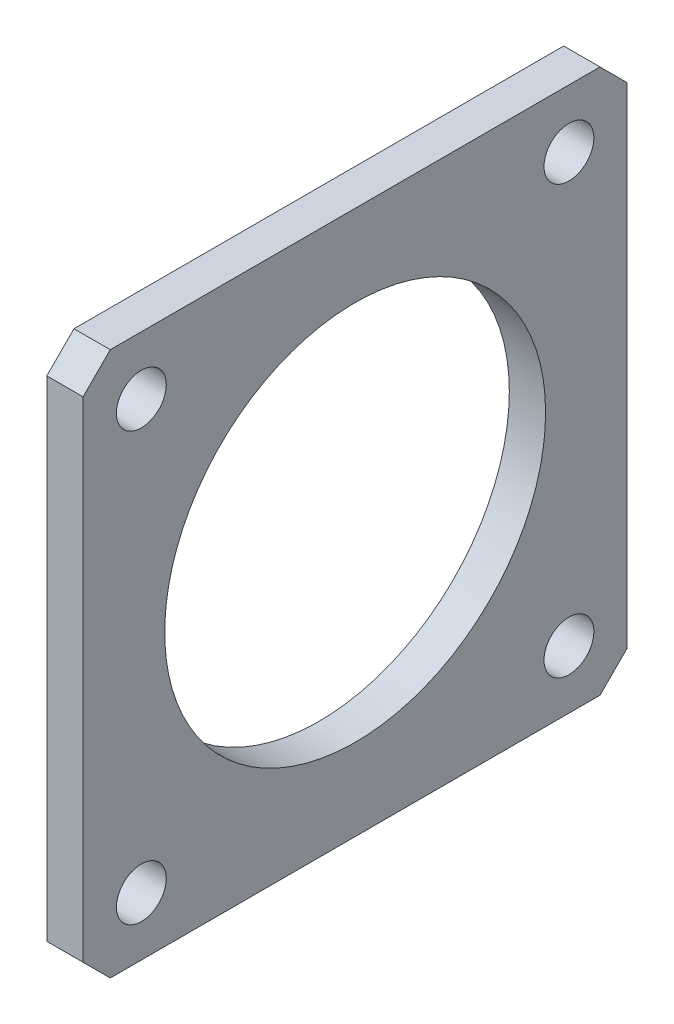
ISO-10303-21;
HEADER;
FILE_DESCRIPTION(('STEP AP214'),'2;1');
FILE_NAME('part.step','',(''),(''),'','','');
FILE_SCHEMA(('AUTOMOTIVE_DESIGN { 1 0 10303 214 1 1 1 1 }'));
ENDSEC;
DATA;
#1=APPLICATION_CONTEXT('core data for automotive mechanical design processes');
#2=APPLICATION_PROTOCOL_DEFINITION('international standard','automotive_design',2000,#1);
#3=PRODUCT_CONTEXT('',#1,'mechanical');
#4=PRODUCT('Part','Part','',(#3));
#5=PRODUCT_RELATED_PRODUCT_CATEGORY('part','',(#4));
#6=PRODUCT_DEFINITION_FORMATION('','',#4);
#7=PRODUCT_DEFINITION_CONTEXT('part definition',#1,'design');
#8=PRODUCT_DEFINITION('design','',#6,#7);
#9=PRODUCT_DEFINITION_SHAPE('','',#8);
#10=(LENGTH_UNIT() NAMED_UNIT(*) SI_UNIT(.MILLI.,.METRE.));
#11=(NAMED_UNIT(*) PLANE_ANGLE_UNIT() SI_UNIT($,.RADIAN.));
#12=(NAMED_UNIT(*) SI_UNIT($,.STERADIAN.) SOLID_ANGLE_UNIT());
#13=UNCERTAINTY_MEASURE_WITH_UNIT(LENGTH_MEASURE(1.E-05),#10,'distance_accuracy_value','');
#14=(GEOMETRIC_REPRESENTATION_CONTEXT(3) GLOBAL_UNCERTAINTY_ASSIGNED_CONTEXT((#13)) GLOBAL_UNIT_ASSIGNED_CONTEXT((#10,
#11,#12)) REPRESENTATION_CONTEXT('',''));
#15=CARTESIAN_POINT('',(0.,0.,0.));
#16=DIRECTION('',(0.,0.,1.));
#17=DIRECTION('',(1.,0.,0.));
#18=AXIS2_PLACEMENT_3D('',#15,#16,#17);
#19=CARTESIAN_POINT('',(-4.,30.,-30.));
#20=DIRECTION('',(0.,0.,-1.));
#21=DIRECTION('',(0.,1.,0.));
#22=AXIS2_PLACEMENT_3D('',#19,#20,#21);
#23=PLANE('',#22);
#24=DIRECTION('',(0.,1.,0.));
#25=VECTOR('',#24,1.);
#26=CARTESIAN_POINT('',(0.,30.,-30.));
#27=LINE('',#26,#25);
#28=CARTESIAN_POINT('',(0.,-27.,-30.));
#29=VERTEX_POINT('',#28);
#30=CARTESIAN_POINT('',(0.,27.,-30.));
#31=VERTEX_POINT('',#30);
#32=EDGE_CURVE('E172',#29,#31,#27,.T.);
#33=ORIENTED_EDGE('',*,*,#32,.F.);
#34=DIRECTION('',(-1.,0.,0.));
#35=VECTOR('',#34,1.);
#36=CARTESIAN_POINT('',(-4.,-27.,-30.));
#37=LINE('',#36,#35);
#38=CARTESIAN_POINT('',(-4.,-27.,-30.));
#39=VERTEX_POINT('',#38);
#40=EDGE_CURVE('E147',#29,#39,#37,.T.);
#41=ORIENTED_EDGE('',*,*,#40,.T.);
#42=DIRECTION('',(0.,1.,0.));
#43=VECTOR('',#42,1.);
#44=CARTESIAN_POINT('',(-4.,30.,-30.));
#45=LINE('',#44,#43);
#46=CARTESIAN_POINT('',(-4.,27.,-30.));
#47=VERTEX_POINT('',#46);
#48=EDGE_CURVE('E129',#39,#47,#45,.T.);
#49=ORIENTED_EDGE('',*,*,#48,.T.);
#50=DIRECTION('',(1.,0.,0.));
#51=VECTOR('',#50,1.);
#52=CARTESIAN_POINT('',(-4.,27.,-30.));
#53=LINE('',#52,#51);
#54=EDGE_CURVE('E148',#47,#31,#53,.T.);
#55=ORIENTED_EDGE('',*,*,#54,.T.);
#56=EDGE_LOOP('',(#33,#41,#49,#55));
#57=FACE_BOUND('',#56,.T.);
#58=ADVANCED_FACE('F45',(#57),#23,.T.);
#59=CARTESIAN_POINT('',(-4.,-30.,30.));
#60=DIRECTION('',(0.,-1.,0.));
#61=DIRECTION('',(0.,0.,-1.));
#62=AXIS2_PLACEMENT_3D('',#59,#60,#61);
#63=PLANE('',#62);
#64=DIRECTION('',(0.,0.,-1.));
#65=VECTOR('',#64,1.);
#66=CARTESIAN_POINT('',(-4.,-30.,30.));
#67=LINE('',#66,#65);
#68=CARTESIAN_POINT('',(-4.,-30.,27.));
#69=VERTEX_POINT('',#68);
#70=CARTESIAN_POINT('',(-4.,-30.,-27.));
#71=VERTEX_POINT('',#70);
#72=EDGE_CURVE('E133',#69,#71,#67,.T.);
#73=ORIENTED_EDGE('',*,*,#72,.T.);
#74=DIRECTION('',(1.,0.,0.));
#75=VECTOR('',#74,1.);
#76=CARTESIAN_POINT('',(-4.,-30.,-27.));
#77=LINE('',#76,#75);
#78=CARTESIAN_POINT('',(0.,-30.,-27.));
#79=VERTEX_POINT('',#78);
#80=EDGE_CURVE('E128',#71,#79,#77,.T.);
#81=ORIENTED_EDGE('',*,*,#80,.T.);
#82=DIRECTION('',(0.,0.,-1.));
#83=VECTOR('',#82,1.);
#84=CARTESIAN_POINT('',(0.,-30.,30.));
#85=LINE('',#84,#83);
#86=CARTESIAN_POINT('',(0.,-30.,27.));
#87=VERTEX_POINT('',#86);
#88=EDGE_CURVE('E111',#87,#79,#85,.T.);
#89=ORIENTED_EDGE('',*,*,#88,.F.);
#90=DIRECTION('',(-1.,0.,0.));
#91=VECTOR('',#90,1.);
#92=CARTESIAN_POINT('',(-4.,-30.,27.));
#93=LINE('',#92,#91);
#94=EDGE_CURVE('E126',#87,#69,#93,.T.);
#95=ORIENTED_EDGE('',*,*,#94,.T.);
#96=EDGE_LOOP('',(#73,#81,#89,#95));
#97=FACE_BOUND('',#96,.T.);
#98=ADVANCED_FACE('F124',(#97),#63,.T.);
#99=CARTESIAN_POINT('',(-4.,30.,30.));
#100=DIRECTION('',(0.,0.,1.));
#101=DIRECTION('',(0.,-1.,0.));
#102=AXIS2_PLACEMENT_3D('',#99,#100,#101);
#103=PLANE('',#102);
#104=DIRECTION('',(0.,-1.,0.));
#105=VECTOR('',#104,1.);
#106=CARTESIAN_POINT('',(-4.,30.,30.));
#107=LINE('',#106,#105);
#108=CARTESIAN_POINT('',(-4.,27.,30.));
#109=VERTEX_POINT('',#108);
#110=CARTESIAN_POINT('',(-4.,-27.,30.));
#111=VERTEX_POINT('',#110);
#112=EDGE_CURVE('E137',#109,#111,#107,.T.);
#113=ORIENTED_EDGE('',*,*,#112,.T.);
#114=DIRECTION('',(1.,0.,0.));
#115=VECTOR('',#114,1.);
#116=CARTESIAN_POINT('',(-4.,-27.,30.));
#117=LINE('',#116,#115);
#118=CARTESIAN_POINT('',(0.,-27.,30.));
#119=VERTEX_POINT('',#118);
#120=EDGE_CURVE('E11',#111,#119,#117,.T.);
#121=ORIENTED_EDGE('',*,*,#120,.T.);
#122=DIRECTION('',(0.,-1.,0.));
#123=VECTOR('',#122,1.);
#124=CARTESIAN_POINT('',(0.,30.,30.));
#125=LINE('',#124,#123);
#126=CARTESIAN_POINT('',(0.,27.,30.));
#127=VERTEX_POINT('',#126);
#128=EDGE_CURVE('E112',#127,#119,#125,.T.);
#129=ORIENTED_EDGE('',*,*,#128,.F.);
#130=DIRECTION('',(-1.,0.,0.));
#131=VECTOR('',#130,1.);
#132=CARTESIAN_POINT('',(-4.,27.,30.));
#133=LINE('',#132,#131);
#134=EDGE_CURVE('E51',#127,#109,#133,.T.);
#135=ORIENTED_EDGE('',*,*,#134,.T.);
#136=EDGE_LOOP('',(#113,#121,#129,#135));
#137=FACE_BOUND('',#136,.T.);
#138=ADVANCED_FACE('F162',(#137),#103,.T.);
#139=CARTESIAN_POINT('',(-4.,30.,30.));
#140=DIRECTION('',(0.,1.,0.));
#141=DIRECTION('',(0.,0.,1.));
#142=AXIS2_PLACEMENT_3D('',#139,#140,#141);
#143=PLANE('',#142);
#144=DIRECTION('',(0.,0.,1.));
#145=VECTOR('',#144,1.);
#146=CARTESIAN_POINT('',(0.,30.,30.));
#147=LINE('',#146,#145);
#148=CARTESIAN_POINT('',(0.,30.,-27.));
#149=VERTEX_POINT('',#148);
#150=CARTESIAN_POINT('',(0.,30.,27.));
#151=VERTEX_POINT('',#150);
#152=EDGE_CURVE('E175',#149,#151,#147,.T.);
#153=ORIENTED_EDGE('',*,*,#152,.F.);
#154=DIRECTION('',(-1.,0.,0.));
#155=VECTOR('',#154,1.);
#156=CARTESIAN_POINT('',(-4.,30.,-27.));
#157=LINE('',#156,#155);
#158=CARTESIAN_POINT('',(-4.,30.,-27.));
#159=VERTEX_POINT('',#158);
#160=EDGE_CURVE('E61',#149,#159,#157,.T.);
#161=ORIENTED_EDGE('',*,*,#160,.T.);
#162=DIRECTION('',(0.,0.,1.));
#163=VECTOR('',#162,1.);
#164=CARTESIAN_POINT('',(-4.,30.,30.));
#165=LINE('',#164,#163);
#166=CARTESIAN_POINT('',(-4.,30.,27.));
#167=VERTEX_POINT('',#166);
#168=EDGE_CURVE('E170',#159,#167,#165,.T.);
#169=ORIENTED_EDGE('',*,*,#168,.T.);
#170=DIRECTION('',(1.,0.,0.));
#171=VECTOR('',#170,1.);
#172=CARTESIAN_POINT('',(-4.,30.,27.));
#173=LINE('',#172,#171);
#174=EDGE_CURVE('E160',#167,#151,#173,.T.);
#175=ORIENTED_EDGE('',*,*,#174,.T.);
#176=EDGE_LOOP('',(#153,#161,#169,#175));
#177=FACE_BOUND('',#176,.T.);
#178=ADVANCED_FACE('F173',(#177),#143,.T.);
#179=CARTESIAN_POINT('',(-4.,0.,0.));
#180=DIRECTION('',(1.,0.,0.));
#181=DIRECTION('',(0.,0.,-1.));
#182=AXIS2_PLACEMENT_3D('',#179,#180,#181);
#183=PLANE('',#182);
#184=CARTESIAN_POINT('',(-4.,23.575,23.575));
#185=DIRECTION('',(1.,0.,0.));
#186=DIRECTION('',(0.,0.,-1.));
#187=AXIS2_PLACEMENT_3D('',#184,#185,#186);
#188=CIRCLE('',#187,2.74999999999999);
#189=CARTESIAN_POINT('',(-4.,23.575,20.825));
#190=VERTEX_POINT('',#189);
#191=EDGE_CURVE('E204',#190,#190,#188,.T.);
#192=ORIENTED_EDGE('',*,*,#191,.T.);
#193=EDGE_LOOP('',(#192));
#194=FACE_BOUND('',#193,.T.);
#195=CARTESIAN_POINT('',(-4.,23.575,-23.575));
#196=DIRECTION('',(1.,0.,0.));
#197=DIRECTION('',(0.,0.,-1.));
#198=AXIS2_PLACEMENT_3D('',#195,#196,#197);
#199=CIRCLE('',#198,2.74999999999999);
#200=CARTESIAN_POINT('',(-4.,23.575,-26.325));
#201=VERTEX_POINT('',#200);
#202=EDGE_CURVE('E197',#201,#201,#199,.T.);
#203=ORIENTED_EDGE('',*,*,#202,.T.);
#204=EDGE_LOOP('',(#203));
#205=FACE_BOUND('',#204,.T.);
#206=CARTESIAN_POINT('',(-4.,-23.575,-23.575));
#207=DIRECTION('',(1.,0.,0.));
#208=DIRECTION('',(0.,0.,-1.));
#209=AXIS2_PLACEMENT_3D('',#206,#207,#208);
#210=CIRCLE('',#209,2.74999999999999);
#211=CARTESIAN_POINT('',(-4.,-23.575,-26.325));
#212=VERTEX_POINT('',#211);
#213=EDGE_CURVE('E193',#212,#212,#210,.T.);
#214=ORIENTED_EDGE('',*,*,#213,.T.);
#215=EDGE_LOOP('',(#214));
#216=FACE_BOUND('',#215,.T.);
#217=CARTESIAN_POINT('',(-4.,-23.575,23.575));
#218=DIRECTION('',(1.,0.,0.));
#219=DIRECTION('',(0.,0.,-1.));
#220=AXIS2_PLACEMENT_3D('',#217,#218,#219);
#221=CIRCLE('',#220,2.74999999999999);
#222=CARTESIAN_POINT('',(-4.,-23.575,20.825));
#223=VERTEX_POINT('',#222);
#224=EDGE_CURVE('E184',#223,#223,#221,.T.);
#225=ORIENTED_EDGE('',*,*,#224,.T.);
#226=EDGE_LOOP('',(#225));
#227=FACE_BOUND('',#226,.T.);
#228=CARTESIAN_POINT('',(-4.,0.,0.));
#229=DIRECTION('',(1.,0.,0.));
#230=DIRECTION('',(0.,0.,-1.));
#231=AXIS2_PLACEMENT_3D('',#228,#229,#230);
#232=CIRCLE('',#231,21.);
#233=CARTESIAN_POINT('',(-4.,0.,-21.));
#234=VERTEX_POINT('',#233);
#235=EDGE_CURVE('E178',#234,#234,#232,.T.);
#236=ORIENTED_EDGE('',*,*,#235,.T.);
#237=EDGE_LOOP('',(#236));
#238=FACE_BOUND('',#237,.T.);
#239=ORIENTED_EDGE('',*,*,#48,.F.);
#240=DIRECTION('',(0.,0.707106781186549,-0.707106781186546));
#241=VECTOR('',#240,1.);
#242=CARTESIAN_POINT('',(-4.,-30.,-27.));
#243=LINE('',#242,#241);
#244=EDGE_CURVE('E154',#39,#71,#243,.F.);
#245=ORIENTED_EDGE('',*,*,#244,.T.);
#246=ORIENTED_EDGE('',*,*,#72,.F.);
#247=DIRECTION('',(0.,-0.707106781186548,-0.707106781186548));
#248=VECTOR('',#247,1.);
#249=CARTESIAN_POINT('',(-4.,-27.,30.));
#250=LINE('',#249,#248);
#251=EDGE_CURVE('E131',#69,#111,#250,.F.);
#252=ORIENTED_EDGE('',*,*,#251,.T.);
#253=ORIENTED_EDGE('',*,*,#112,.F.);
#254=DIRECTION('',(0.,-0.707106781186549,0.707106781186546));
#255=VECTOR('',#254,1.);
#256=CARTESIAN_POINT('',(-4.,30.,27.));
#257=LINE('',#256,#255);
#258=EDGE_CURVE('E59',#109,#167,#257,.F.);
#259=ORIENTED_EDGE('',*,*,#258,.T.);
#260=ORIENTED_EDGE('',*,*,#168,.F.);
#261=DIRECTION('',(0.,0.707106781186548,0.707106781186548));
#262=VECTOR('',#261,1.);
#263=CARTESIAN_POINT('',(-4.,27.,-30.));
#264=LINE('',#263,#262);
#265=EDGE_CURVE('E151',#159,#47,#264,.F.);
#266=ORIENTED_EDGE('',*,*,#265,.T.);
#267=EDGE_LOOP('',(#239,#245,#246,#252,#253,#259,#260,#266));
#268=FACE_BOUND('',#267,.T.);
#269=ADVANCED_FACE('F167',(#194,#205,#216,#227,#238,#268),#183,.F.);
#270=CARTESIAN_POINT('',(0.,0.,0.));
#271=DIRECTION('',(1.,0.,0.));
#272=DIRECTION('',(0.,0.,-1.));
#273=AXIS2_PLACEMENT_3D('',#270,#271,#272);
#274=PLANE('',#273);
#275=CARTESIAN_POINT('',(0.,23.575,23.575));
#276=DIRECTION('',(1.,0.,0.));
#277=DIRECTION('',(0.,0.,-1.));
#278=AXIS2_PLACEMENT_3D('',#275,#276,#277);
#279=CIRCLE('',#278,2.74999999999999);
#280=CARTESIAN_POINT('',(0.,23.575,20.825));
#281=VERTEX_POINT('',#280);
#282=EDGE_CURVE('E209',#281,#281,#279,.T.);
#283=ORIENTED_EDGE('',*,*,#282,.F.);
#284=EDGE_LOOP('',(#283));
#285=FACE_BOUND('',#284,.T.);
#286=CARTESIAN_POINT('',(0.,23.575,-23.575));
#287=DIRECTION('',(1.,0.,0.));
#288=DIRECTION('',(0.,0.,-1.));
#289=AXIS2_PLACEMENT_3D('',#286,#287,#288);
#290=CIRCLE('',#289,2.74999999999999);
#291=CARTESIAN_POINT('',(0.,23.575,-26.325));
#292=VERTEX_POINT('',#291);
#293=EDGE_CURVE('E205',#292,#292,#290,.T.);
#294=ORIENTED_EDGE('',*,*,#293,.F.);
#295=EDGE_LOOP('',(#294));
#296=FACE_BOUND('',#295,.T.);
#297=CARTESIAN_POINT('',(0.,-23.575,-23.575));
#298=DIRECTION('',(1.,0.,0.));
#299=DIRECTION('',(0.,0.,-1.));
#300=AXIS2_PLACEMENT_3D('',#297,#298,#299);
#301=CIRCLE('',#300,2.74999999999999);
#302=CARTESIAN_POINT('',(0.,-23.575,-26.325));
#303=VERTEX_POINT('',#302);
#304=EDGE_CURVE('E196',#303,#303,#301,.T.);
#305=ORIENTED_EDGE('',*,*,#304,.F.);
#306=EDGE_LOOP('',(#305));
#307=FACE_BOUND('',#306,.T.);
#308=CARTESIAN_POINT('',(0.,-23.575,23.575));
#309=DIRECTION('',(1.,0.,0.));
#310=DIRECTION('',(0.,0.,-1.));
#311=AXIS2_PLACEMENT_3D('',#308,#309,#310);
#312=CIRCLE('',#311,2.74999999999999);
#313=CARTESIAN_POINT('',(0.,-23.575,20.825));
#314=VERTEX_POINT('',#313);
#315=EDGE_CURVE('E187',#314,#314,#312,.T.);
#316=ORIENTED_EDGE('',*,*,#315,.F.);
#317=EDGE_LOOP('',(#316));
#318=FACE_BOUND('',#317,.T.);
#319=CARTESIAN_POINT('',(0.,0.,0.));
#320=DIRECTION('',(1.,0.,0.));
#321=DIRECTION('',(0.,0.,-1.));
#322=AXIS2_PLACEMENT_3D('',#319,#320,#321);
#323=CIRCLE('',#322,21.);
#324=CARTESIAN_POINT('',(0.,0.,-21.));
#325=VERTEX_POINT('',#324);
#326=EDGE_CURVE('E182',#325,#325,#323,.T.);
#327=ORIENTED_EDGE('',*,*,#326,.F.);
#328=EDGE_LOOP('',(#327));
#329=FACE_BOUND('',#328,.T.);
#330=ORIENTED_EDGE('',*,*,#88,.T.);
#331=DIRECTION('',(0.,-0.707106781186549,0.707106781186546));
#332=VECTOR('',#331,1.);
#333=CARTESIAN_POINT('',(0.,-28.4999999999999,-28.5000000000001));
#334=LINE('',#333,#332);
#335=EDGE_CURVE('E144',#79,#29,#334,.F.);
#336=ORIENTED_EDGE('',*,*,#335,.T.);
#337=ORIENTED_EDGE('',*,*,#32,.T.);
#338=DIRECTION('',(0.,-0.707106781186548,-0.707106781186548));
#339=VECTOR('',#338,1.);
#340=CARTESIAN_POINT('',(0.,28.5,-28.5));
#341=LINE('',#340,#339);
#342=EDGE_CURVE('E117',#31,#149,#341,.F.);
#343=ORIENTED_EDGE('',*,*,#342,.T.);
#344=ORIENTED_EDGE('',*,*,#152,.T.);
#345=DIRECTION('',(0.,0.707106781186549,-0.707106781186546));
#346=VECTOR('',#345,1.);
#347=CARTESIAN_POINT('',(0.,28.4999999999999,28.5000000000001));
#348=LINE('',#347,#346);
#349=EDGE_CURVE('E119',#151,#127,#348,.F.);
#350=ORIENTED_EDGE('',*,*,#349,.T.);
#351=ORIENTED_EDGE('',*,*,#128,.T.);
#352=DIRECTION('',(0.,0.707106781186548,0.707106781186548));
#353=VECTOR('',#352,1.);
#354=CARTESIAN_POINT('',(0.,-28.5,28.5));
#355=LINE('',#354,#353);
#356=EDGE_CURVE('E109',#119,#87,#355,.F.);
#357=ORIENTED_EDGE('',*,*,#356,.T.);
#358=EDGE_LOOP('',(#330,#336,#337,#343,#344,#350,#351,#357));
#359=FACE_BOUND('',#358,.T.);
#360=ADVANCED_FACE('F115',(#285,#296,#307,#318,#329,#359),#274,.T.);
#361=CARTESIAN_POINT('',(-4.,0.,0.));
#362=DIRECTION('',(1.,0.,0.));
#363=DIRECTION('',(0.,0.,-1.));
#364=AXIS2_PLACEMENT_3D('',#361,#362,#363);
#365=CYLINDRICAL_SURFACE('',#364,21.);
#366=ORIENTED_EDGE('',*,*,#235,.F.);
#367=EDGE_LOOP('',(#366));
#368=FACE_BOUND('',#367,.T.);
#369=ORIENTED_EDGE('',*,*,#326,.T.);
#370=EDGE_LOOP('',(#369));
#371=FACE_BOUND('',#370,.T.);
#372=ADVANCED_FACE('F220',(#368,#371),#365,.F.);
#373=CARTESIAN_POINT('',(0.,-23.575,23.575));
#374=DIRECTION('',(1.,0.,0.));
#375=DIRECTION('',(0.,0.,-1.));
#376=AXIS2_PLACEMENT_3D('',#373,#374,#375);
#377=CYLINDRICAL_SURFACE('',#376,2.74999999999999);
#378=ORIENTED_EDGE('',*,*,#315,.T.);
#379=EDGE_LOOP('',(#378));
#380=FACE_BOUND('',#379,.T.);
#381=ORIENTED_EDGE('',*,*,#224,.F.);
#382=EDGE_LOOP('',(#381));
#383=FACE_BOUND('',#382,.T.);
#384=ADVANCED_FACE('F226',(#380,#383),#377,.F.);
#385=CARTESIAN_POINT('',(0.,-23.575,-23.575));
#386=DIRECTION('',(1.,0.,0.));
#387=DIRECTION('',(0.,0.,-1.));
#388=AXIS2_PLACEMENT_3D('',#385,#386,#387);
#389=CYLINDRICAL_SURFACE('',#388,2.74999999999999);
#390=ORIENTED_EDGE('',*,*,#304,.T.);
#391=EDGE_LOOP('',(#390));
#392=FACE_BOUND('',#391,.T.);
#393=ORIENTED_EDGE('',*,*,#213,.F.);
#394=EDGE_LOOP('',(#393));
#395=FACE_BOUND('',#394,.T.);
#396=ADVANCED_FACE('F234',(#392,#395),#389,.F.);
#397=CARTESIAN_POINT('',(0.,23.575,-23.575));
#398=DIRECTION('',(1.,0.,0.));
#399=DIRECTION('',(0.,0.,-1.));
#400=AXIS2_PLACEMENT_3D('',#397,#398,#399);
#401=CYLINDRICAL_SURFACE('',#400,2.74999999999999);
#402=ORIENTED_EDGE('',*,*,#293,.T.);
#403=EDGE_LOOP('',(#402));
#404=FACE_BOUND('',#403,.T.);
#405=ORIENTED_EDGE('',*,*,#202,.F.);
#406=EDGE_LOOP('',(#405));
#407=FACE_BOUND('',#406,.T.);
#408=ADVANCED_FACE('F296',(#404,#407),#401,.F.);
#409=CARTESIAN_POINT('',(0.,23.575,23.575));
#410=DIRECTION('',(1.,0.,0.));
#411=DIRECTION('',(0.,0.,-1.));
#412=AXIS2_PLACEMENT_3D('',#409,#410,#411);
#413=CYLINDRICAL_SURFACE('',#412,2.74999999999999);
#414=ORIENTED_EDGE('',*,*,#282,.T.);
#415=EDGE_LOOP('',(#414));
#416=FACE_BOUND('',#415,.T.);
#417=ORIENTED_EDGE('',*,*,#191,.F.);
#418=EDGE_LOOP('',(#417));
#419=FACE_BOUND('',#418,.T.);
#420=ADVANCED_FACE('F214',(#416,#419),#413,.F.);
#421=CARTESIAN_POINT('',(-4.,-30.,-27.));
#422=DIRECTION('',(0.,0.707106781186546,0.707106781186549));
#423=DIRECTION('',(1.,0.,0.));
#424=AXIS2_PLACEMENT_3D('',#421,#422,#423);
#425=PLANE('',#424);
#426=ORIENTED_EDGE('',*,*,#244,.F.);
#427=ORIENTED_EDGE('',*,*,#40,.F.);
#428=ORIENTED_EDGE('',*,*,#335,.F.);
#429=ORIENTED_EDGE('',*,*,#80,.F.);
#430=EDGE_LOOP('',(#426,#427,#428,#429));
#431=FACE_BOUND('',#430,.T.);
#432=ADVANCED_FACE('F255',(#431),#425,.F.);
#433=CARTESIAN_POINT('',(-4.,27.,-30.));
#434=DIRECTION('',(0.,-0.707106781186548,0.707106781186548));
#435=DIRECTION('',(1.,0.,0.));
#436=AXIS2_PLACEMENT_3D('',#433,#434,#435);
#437=PLANE('',#436);
#438=ORIENTED_EDGE('',*,*,#265,.F.);
#439=ORIENTED_EDGE('',*,*,#160,.F.);
#440=ORIENTED_EDGE('',*,*,#342,.F.);
#441=ORIENTED_EDGE('',*,*,#54,.F.);
#442=EDGE_LOOP('',(#438,#439,#440,#441));
#443=FACE_BOUND('',#442,.T.);
#444=ADVANCED_FACE('F256',(#443),#437,.F.);
#445=CARTESIAN_POINT('',(-4.,-27.,30.));
#446=DIRECTION('',(0.,0.707106781186548,-0.707106781186548));
#447=DIRECTION('',(1.,0.,0.));
#448=AXIS2_PLACEMENT_3D('',#445,#446,#447);
#449=PLANE('',#448);
#450=ORIENTED_EDGE('',*,*,#251,.F.);
#451=ORIENTED_EDGE('',*,*,#94,.F.);
#452=ORIENTED_EDGE('',*,*,#356,.F.);
#453=ORIENTED_EDGE('',*,*,#120,.F.);
#454=EDGE_LOOP('',(#450,#451,#452,#453));
#455=FACE_BOUND('',#454,.T.);
#456=ADVANCED_FACE('F134',(#455),#449,.F.);
#457=CARTESIAN_POINT('',(-4.,30.,27.));
#458=DIRECTION('',(0.,-0.707106781186546,-0.707106781186549));
#459=DIRECTION('',(1.,0.,0.));
#460=AXIS2_PLACEMENT_3D('',#457,#458,#459);
#461=PLANE('',#460);
#462=ORIENTED_EDGE('',*,*,#258,.F.);
#463=ORIENTED_EDGE('',*,*,#134,.F.);
#464=ORIENTED_EDGE('',*,*,#349,.F.);
#465=ORIENTED_EDGE('',*,*,#174,.F.);
#466=EDGE_LOOP('',(#462,#463,#464,#465));
#467=FACE_BOUND('',#466,.T.);
#468=ADVANCED_FACE('F44',(#467),#461,.F.);
#469=CLOSED_SHELL('',(#58,#98,#138,#178,#269,#360,#372,#384,#396,#408,#420,#432,#444,#456,#468));
#470=MANIFOLD_SOLID_BREP('B2',#469);
#471=ADVANCED_BREP_SHAPE_REPRESENTATION('',(#18,#470),#14);
#472=SHAPE_DEFINITION_REPRESENTATION(#9,#471);
ENDSEC;
END-ISO-10303-21;
